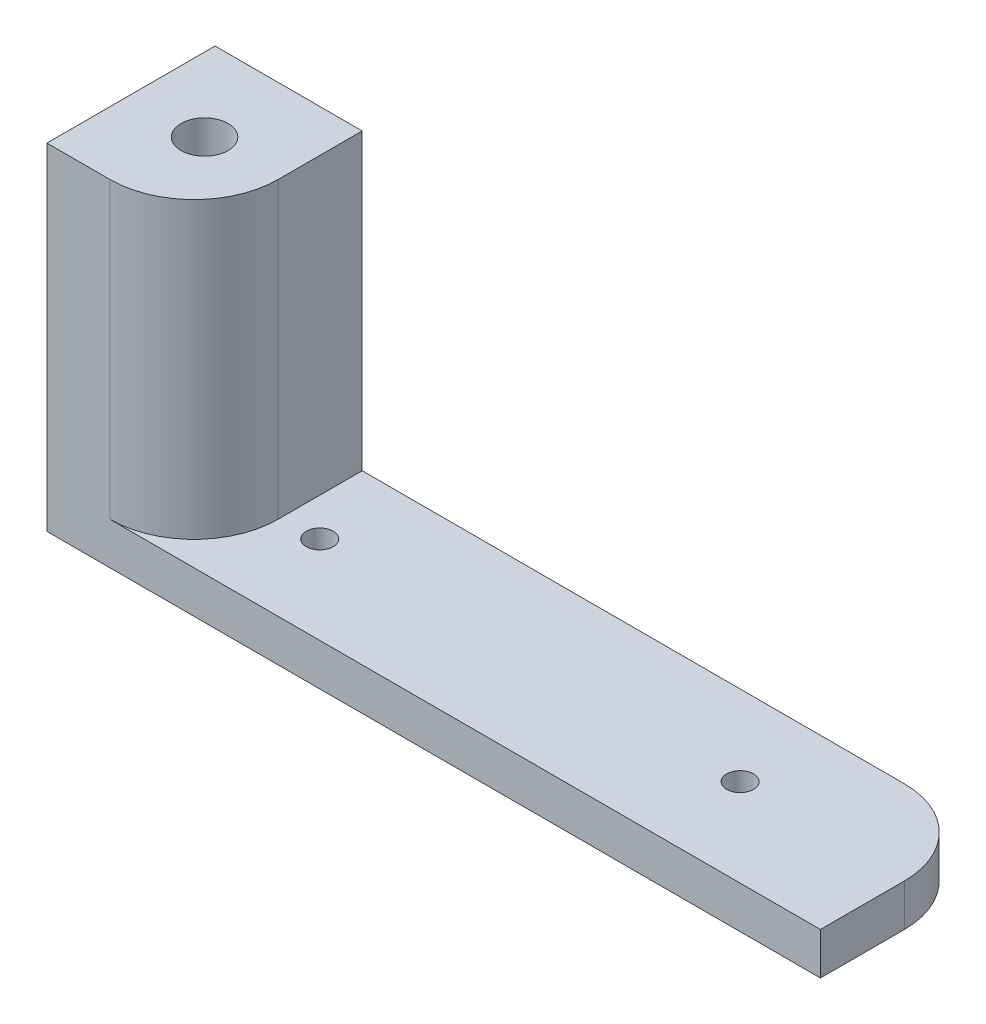
ISO-10303-21;
HEADER;
FILE_DESCRIPTION(('STEP AP214'),'2;1');
FILE_NAME('part.step','',(''),(''),'','','');
FILE_SCHEMA(('AUTOMOTIVE_DESIGN { 1 0 10303 214 1 1 1 1 }'));
ENDSEC;
DATA;
#1=APPLICATION_CONTEXT('core data for automotive mechanical design processes');
#2=APPLICATION_PROTOCOL_DEFINITION('international standard','automotive_design',2000,#1);
#3=PRODUCT_CONTEXT('',#1,'mechanical');
#4=PRODUCT('Part','Part','',(#3));
#5=PRODUCT_RELATED_PRODUCT_CATEGORY('part','',(#4));
#6=PRODUCT_DEFINITION_FORMATION('','',#4);
#7=PRODUCT_DEFINITION_CONTEXT('part definition',#1,'design');
#8=PRODUCT_DEFINITION('design','',#6,#7);
#9=PRODUCT_DEFINITION_SHAPE('','',#8);
#10=(LENGTH_UNIT() NAMED_UNIT(*) SI_UNIT(.MILLI.,.METRE.));
#11=(NAMED_UNIT(*) PLANE_ANGLE_UNIT() SI_UNIT($,.RADIAN.));
#12=(NAMED_UNIT(*) SI_UNIT($,.STERADIAN.) SOLID_ANGLE_UNIT());
#13=UNCERTAINTY_MEASURE_WITH_UNIT(LENGTH_MEASURE(1.E-05),#10,'distance_accuracy_value','');
#14=(GEOMETRIC_REPRESENTATION_CONTEXT(3) GLOBAL_UNCERTAINTY_ASSIGNED_CONTEXT((#13)) GLOBAL_UNIT_ASSIGNED_CONTEXT((#10,
#11,#12)) REPRESENTATION_CONTEXT('',''));
#15=CARTESIAN_POINT('',(0.,0.,0.));
#16=DIRECTION('',(0.,0.,1.));
#17=DIRECTION('',(1.,0.,0.));
#18=AXIS2_PLACEMENT_3D('',#15,#16,#17);
#19=CARTESIAN_POINT('',(0.,5.,0.));
#20=DIRECTION('',(0.,-1.,0.));
#21=DIRECTION('',(0.,0.,-1.));
#22=AXIS2_PLACEMENT_3D('',#19,#20,#21);
#23=PLANE('',#22);
#24=CARTESIAN_POINT('',(-24.,5.,-0.449999999999999));
#25=DIRECTION('',(0.,-1.,0.));
#26=DIRECTION('',(0.,0.,1.));
#27=AXIS2_PLACEMENT_3D('',#24,#25,#26);
#28=CIRCLE('',#27,1.6);
#29=CARTESIAN_POINT('',(-24.,5.,1.15));
#30=VERTEX_POINT('',#29);
#31=EDGE_CURVE('E243',#30,#30,#28,.T.);
#32=ORIENTED_EDGE('',*,*,#31,.T.);
#33=EDGE_LOOP('',(#32));
#34=FACE_BOUND('',#33,.T.);
#35=CARTESIAN_POINT('',(26.,5.,-0.449999999999999));
#36=DIRECTION('',(0.,-1.,0.));
#37=DIRECTION('',(0.,0.,1.));
#38=AXIS2_PLACEMENT_3D('',#35,#36,#37);
#39=CIRCLE('',#38,1.6);
#40=CARTESIAN_POINT('',(26.,5.,1.15));
#41=VERTEX_POINT('',#40);
#42=EDGE_CURVE('E239',#41,#41,#39,.T.);
#43=ORIENTED_EDGE('',*,*,#42,.T.);
#44=EDGE_LOOP('',(#43));
#45=FACE_BOUND('',#44,.T.);
#46=DIRECTION('',(0.,0.,1.));
#47=VECTOR('',#46,1.);
#48=CARTESIAN_POINT('',(-28.5,5.,-10.));
#49=LINE('',#48,#47);
#50=CARTESIAN_POINT('',(-28.5,5.,-10.));
#51=VERTEX_POINT('',#50);
#52=CARTESIAN_POINT('',(-28.5,5.,0.));
#53=VERTEX_POINT('',#52);
#54=EDGE_CURVE('E223',#51,#53,#49,.T.);
#55=ORIENTED_EDGE('',*,*,#54,.T.);
#56=CARTESIAN_POINT('',(-38.5,5.,0.));
#57=DIRECTION('',(0.,1.,0.));
#58=DIRECTION('',(0.,0.,-1.));
#59=AXIS2_PLACEMENT_3D('',#56,#57,#58);
#60=CIRCLE('',#59,10.);
#61=CARTESIAN_POINT('',(-38.5,5.,10.));
#62=VERTEX_POINT('',#61);
#63=EDGE_CURVE('E11',#62,#53,#60,.T.);
#64=ORIENTED_EDGE('',*,*,#63,.F.);
#65=DIRECTION('',(-1.,0.,0.));
#66=VECTOR('',#65,1.);
#67=CARTESIAN_POINT('',(46.,5.,10.));
#68=LINE('',#67,#66);
#69=CARTESIAN_POINT('',(46.,5.,10.));
#70=VERTEX_POINT('',#69);
#71=EDGE_CURVE('E155',#70,#62,#68,.T.);
#72=ORIENTED_EDGE('',*,*,#71,.F.);
#73=DIRECTION('',(0.,0.,1.));
#74=VECTOR('',#73,1.);
#75=CARTESIAN_POINT('',(46.,5.,10.));
#76=LINE('',#75,#74);
#77=CARTESIAN_POINT('',(46.,5.,0.));
#78=VERTEX_POINT('',#77);
#79=EDGE_CURVE('E165',#78,#70,#76,.T.);
#80=ORIENTED_EDGE('',*,*,#79,.F.);
#81=CARTESIAN_POINT('',(36.,5.,0.));
#82=DIRECTION('',(0.,1.,0.));
#83=DIRECTION('',(0.,0.,-1.));
#84=AXIS2_PLACEMENT_3D('',#81,#82,#83);
#85=CIRCLE('',#84,10.);
#86=CARTESIAN_POINT('',(36.,5.,-10.));
#87=VERTEX_POINT('',#86);
#88=EDGE_CURVE('E187',#87,#78,#85,.F.);
#89=ORIENTED_EDGE('',*,*,#88,.F.);
#90=DIRECTION('',(1.,0.,0.));
#91=VECTOR('',#90,1.);
#92=CARTESIAN_POINT('',(46.,5.,-10.));
#93=LINE('',#92,#91);
#94=EDGE_CURVE('E250',#51,#87,#93,.T.);
#95=ORIENTED_EDGE('',*,*,#94,.F.);
#96=EDGE_LOOP('',(#55,#64,#72,#80,#89,#95));
#97=FACE_BOUND('',#96,.T.);
#98=ADVANCED_FACE('F51',(#34,#45,#97),#23,.F.);
#99=CARTESIAN_POINT('',(-46.,5.,10.));
#100=DIRECTION('',(1.,0.,0.));
#101=DIRECTION('',(0.,0.,1.));
#102=AXIS2_PLACEMENT_3D('',#99,#100,#101);
#103=PLANE('',#102);
#104=DIRECTION('',(0.,0.,-1.));
#105=VECTOR('',#104,1.);
#106=CARTESIAN_POINT('',(-46.,0.,10.));
#107=LINE('',#106,#105);
#108=CARTESIAN_POINT('',(-46.,0.,10.));
#109=VERTEX_POINT('',#108);
#110=CARTESIAN_POINT('',(-46.,0.,0.));
#111=VERTEX_POINT('',#110);
#112=EDGE_CURVE('E152',#109,#111,#107,.T.);
#113=ORIENTED_EDGE('',*,*,#112,.F.);
#114=DIRECTION('',(0.,-1.,0.));
#115=VECTOR('',#114,1.);
#116=CARTESIAN_POINT('',(-46.,5.,10.));
#117=LINE('',#116,#115);
#118=CARTESIAN_POINT('',(-46.,40.,10.));
#119=VERTEX_POINT('',#118);
#120=EDGE_CURVE('E132',#119,#109,#117,.T.);
#121=ORIENTED_EDGE('',*,*,#120,.F.);
#122=DIRECTION('',(0.,0.,-1.));
#123=VECTOR('',#122,1.);
#124=CARTESIAN_POINT('',(-46.,40.,-10.));
#125=LINE('',#124,#123);
#126=CARTESIAN_POINT('',(-46.,40.,-10.));
#127=VERTEX_POINT('',#126);
#128=EDGE_CURVE('E137',#119,#127,#125,.T.);
#129=ORIENTED_EDGE('',*,*,#128,.T.);
#130=DIRECTION('',(0.,-1.,0.));
#131=VECTOR('',#130,1.);
#132=CARTESIAN_POINT('',(-46.,40.,-10.));
#133=LINE('',#132,#131);
#134=CARTESIAN_POINT('',(-46.,5.,-10.));
#135=VERTEX_POINT('',#134);
#136=EDGE_CURVE('E231',#127,#135,#133,.T.);
#137=ORIENTED_EDGE('',*,*,#136,.T.);
#138=DIRECTION('',(0.,0.,-1.));
#139=VECTOR('',#138,1.);
#140=CARTESIAN_POINT('',(-46.,5.,-10.));
#141=LINE('',#140,#139);
#142=CARTESIAN_POINT('',(-46.,5.,0.));
#143=VERTEX_POINT('',#142);
#144=EDGE_CURVE('E215',#143,#135,#141,.T.);
#145=ORIENTED_EDGE('',*,*,#144,.F.);
#146=DIRECTION('',(0.,-1.,0.));
#147=VECTOR('',#146,1.);
#148=CARTESIAN_POINT('',(-46.,5.,0.));
#149=LINE('',#148,#147);
#150=EDGE_CURVE('E183',#111,#143,#149,.F.);
#151=ORIENTED_EDGE('',*,*,#150,.F.);
#152=EDGE_LOOP('',(#113,#121,#129,#137,#145,#151));
#153=FACE_BOUND('',#152,.T.);
#154=ADVANCED_FACE('F149',(#153),#103,.F.);
#155=CARTESIAN_POINT('',(46.,5.,-10.));
#156=DIRECTION('',(0.,0.,1.));
#157=DIRECTION('',(-1.,0.,0.));
#158=AXIS2_PLACEMENT_3D('',#155,#156,#157);
#159=PLANE('',#158);
#160=ORIENTED_EDGE('',*,*,#94,.T.);
#161=DIRECTION('',(0.,-1.,0.));
#162=VECTOR('',#161,1.);
#163=CARTESIAN_POINT('',(36.,5.,-10.));
#164=LINE('',#163,#162);
#165=CARTESIAN_POINT('',(36.,0.,-10.));
#166=VERTEX_POINT('',#165);
#167=EDGE_CURVE('E162',#166,#87,#164,.F.);
#168=ORIENTED_EDGE('',*,*,#167,.F.);
#169=DIRECTION('',(1.,0.,0.));
#170=VECTOR('',#169,1.);
#171=CARTESIAN_POINT('',(46.,0.,-10.));
#172=LINE('',#171,#170);
#173=CARTESIAN_POINT('',(-36.,0.,-10.));
#174=VERTEX_POINT('',#173);
#175=EDGE_CURVE('E259',#174,#166,#172,.T.);
#176=ORIENTED_EDGE('',*,*,#175,.F.);
#177=DIRECTION('',(0.,-1.,0.));
#178=VECTOR('',#177,1.);
#179=CARTESIAN_POINT('',(-36.,5.,-10.));
#180=LINE('',#179,#178);
#181=CARTESIAN_POINT('',(-36.,5.,-10.));
#182=VERTEX_POINT('',#181);
#183=EDGE_CURVE('E173',#182,#174,#180,.T.);
#184=ORIENTED_EDGE('',*,*,#183,.F.);
#185=DIRECTION('',(1.,0.,0.));
#186=VECTOR('',#185,1.);
#187=CARTESIAN_POINT('',(-28.5,5.,-10.));
#188=LINE('',#187,#186);
#189=EDGE_CURVE('E209',#135,#182,#188,.T.);
#190=ORIENTED_EDGE('',*,*,#189,.F.);
#191=ORIENTED_EDGE('',*,*,#136,.F.);
#192=DIRECTION('',(1.,0.,0.));
#193=VECTOR('',#192,1.);
#194=CARTESIAN_POINT('',(-28.5,40.,-10.));
#195=LINE('',#194,#193);
#196=CARTESIAN_POINT('',(-28.5,40.,-10.));
#197=VERTEX_POINT('',#196);
#198=EDGE_CURVE('E143',#127,#197,#195,.T.);
#199=ORIENTED_EDGE('',*,*,#198,.T.);
#200=DIRECTION('',(0.,-1.,0.));
#201=VECTOR('',#200,1.);
#202=CARTESIAN_POINT('',(-28.5,40.,-10.));
#203=LINE('',#202,#201);
#204=EDGE_CURVE('E208',#197,#51,#203,.T.);
#205=ORIENTED_EDGE('',*,*,#204,.T.);
#206=EDGE_LOOP('',(#160,#168,#176,#184,#190,#191,#199,#205));
#207=FACE_BOUND('',#206,.T.);
#208=ADVANCED_FACE('F279',(#207),#159,.F.);
#209=CARTESIAN_POINT('',(46.,5.,10.));
#210=DIRECTION('',(-1.,0.,0.));
#211=DIRECTION('',(0.,0.,-1.));
#212=AXIS2_PLACEMENT_3D('',#209,#210,#211);
#213=PLANE('',#212);
#214=ORIENTED_EDGE('',*,*,#79,.T.);
#215=DIRECTION('',(0.,-1.,0.));
#216=VECTOR('',#215,1.);
#217=CARTESIAN_POINT('',(46.,5.,10.));
#218=LINE('',#217,#216);
#219=CARTESIAN_POINT('',(46.,0.,10.));
#220=VERTEX_POINT('',#219);
#221=EDGE_CURVE('E154',#70,#220,#218,.T.);
#222=ORIENTED_EDGE('',*,*,#221,.T.);
#223=DIRECTION('',(0.,0.,1.));
#224=VECTOR('',#223,1.);
#225=CARTESIAN_POINT('',(46.,0.,10.));
#226=LINE('',#225,#224);
#227=CARTESIAN_POINT('',(46.,0.,0.));
#228=VERTEX_POINT('',#227);
#229=EDGE_CURVE('E262',#228,#220,#226,.T.);
#230=ORIENTED_EDGE('',*,*,#229,.F.);
#231=DIRECTION('',(0.,-1.,0.));
#232=VECTOR('',#231,1.);
#233=CARTESIAN_POINT('',(46.,5.,0.));
#234=LINE('',#233,#232);
#235=EDGE_CURVE('E194',#78,#228,#234,.T.);
#236=ORIENTED_EDGE('',*,*,#235,.F.);
#237=EDGE_LOOP('',(#214,#222,#230,#236));
#238=FACE_BOUND('',#237,.T.);
#239=ADVANCED_FACE('F273',(#238),#213,.F.);
#240=CARTESIAN_POINT('',(46.,5.,10.));
#241=DIRECTION('',(0.,0.,-1.));
#242=DIRECTION('',(1.,0.,0.));
#243=AXIS2_PLACEMENT_3D('',#240,#241,#242);
#244=PLANE('',#243);
#245=DIRECTION('',(-1.,0.,0.));
#246=VECTOR('',#245,1.);
#247=CARTESIAN_POINT('',(-28.5,40.,10.));
#248=LINE('',#247,#246);
#249=CARTESIAN_POINT('',(-38.5,40.,10.));
#250=VERTEX_POINT('',#249);
#251=EDGE_CURVE('E128',#250,#119,#248,.T.);
#252=ORIENTED_EDGE('',*,*,#251,.T.);
#253=ORIENTED_EDGE('',*,*,#120,.T.);
#254=DIRECTION('',(-1.,0.,0.));
#255=VECTOR('',#254,1.);
#256=CARTESIAN_POINT('',(46.,0.,10.));
#257=LINE('',#256,#255);
#258=EDGE_CURVE('E168',#220,#109,#257,.T.);
#259=ORIENTED_EDGE('',*,*,#258,.F.);
#260=ORIENTED_EDGE('',*,*,#221,.F.);
#261=ORIENTED_EDGE('',*,*,#71,.T.);
#262=DIRECTION('',(0.,-1.,0.));
#263=VECTOR('',#262,1.);
#264=CARTESIAN_POINT('',(-38.5,5.,10.));
#265=LINE('',#264,#263);
#266=EDGE_CURVE('E135',#250,#62,#265,.T.);
#267=ORIENTED_EDGE('',*,*,#266,.F.);
#268=EDGE_LOOP('',(#252,#253,#259,#260,#261,#267));
#269=FACE_BOUND('',#268,.T.);
#270=ADVANCED_FACE('F130',(#269),#244,.F.);
#271=CARTESIAN_POINT('',(0.,0.,0.));
#272=DIRECTION('',(0.,-1.,0.));
#273=DIRECTION('',(0.,0.,-1.));
#274=AXIS2_PLACEMENT_3D('',#271,#272,#273);
#275=PLANE('',#274);
#276=CARTESIAN_POINT('',(-37.25,0.,0.));
#277=DIRECTION('',(0.,1.,0.));
#278=DIRECTION('',(0.,0.,-1.));
#279=AXIS2_PLACEMENT_3D('',#276,#277,#278);
#280=CIRCLE('',#279,2.8);
#281=CARTESIAN_POINT('',(-37.25,0.,2.8));
#282=VERTEX_POINT('',#281);
#283=EDGE_CURVE('E218',#282,#282,#280,.T.);
#284=ORIENTED_EDGE('',*,*,#283,.T.);
#285=EDGE_LOOP('',(#284));
#286=FACE_BOUND('',#285,.T.);
#287=CARTESIAN_POINT('',(26.,0.,-0.449999999999999));
#288=DIRECTION('',(0.,-1.,0.));
#289=DIRECTION('',(0.,0.,1.));
#290=AXIS2_PLACEMENT_3D('',#287,#288,#289);
#291=CIRCLE('',#290,1.6);
#292=CARTESIAN_POINT('',(26.,0.,1.15));
#293=VERTEX_POINT('',#292);
#294=EDGE_CURVE('E235',#293,#293,#291,.T.);
#295=ORIENTED_EDGE('',*,*,#294,.F.);
#296=EDGE_LOOP('',(#295));
#297=FACE_BOUND('',#296,.T.);
#298=CARTESIAN_POINT('',(-24.,0.,-0.449999999999999));
#299=DIRECTION('',(0.,-1.,0.));
#300=DIRECTION('',(0.,0.,1.));
#301=AXIS2_PLACEMENT_3D('',#298,#299,#300);
#302=CIRCLE('',#301,1.6);
#303=CARTESIAN_POINT('',(-24.,0.,1.15));
#304=VERTEX_POINT('',#303);
#305=EDGE_CURVE('E234',#304,#304,#302,.T.);
#306=ORIENTED_EDGE('',*,*,#305,.F.);
#307=EDGE_LOOP('',(#306));
#308=FACE_BOUND('',#307,.T.);
#309=ORIENTED_EDGE('',*,*,#175,.T.);
#310=CARTESIAN_POINT('',(36.,0.,0.));
#311=DIRECTION('',(0.,1.,0.));
#312=DIRECTION('',(0.,0.,-1.));
#313=AXIS2_PLACEMENT_3D('',#310,#311,#312);
#314=CIRCLE('',#313,10.);
#315=EDGE_CURVE('E177',#228,#166,#314,.T.);
#316=ORIENTED_EDGE('',*,*,#315,.F.);
#317=ORIENTED_EDGE('',*,*,#229,.T.);
#318=ORIENTED_EDGE('',*,*,#258,.T.);
#319=ORIENTED_EDGE('',*,*,#112,.T.);
#320=CARTESIAN_POINT('',(-36.,0.,0.));
#321=DIRECTION('',(0.,1.,0.));
#322=DIRECTION('',(0.,0.,-1.));
#323=AXIS2_PLACEMENT_3D('',#320,#321,#322);
#324=CIRCLE('',#323,10.);
#325=EDGE_CURVE('E180',#174,#111,#324,.T.);
#326=ORIENTED_EDGE('',*,*,#325,.F.);
#327=EDGE_LOOP('',(#309,#316,#317,#318,#319,#326));
#328=FACE_BOUND('',#327,.T.);
#329=ADVANCED_FACE('F269',(#286,#297,#308,#328),#275,.T.);
#330=CARTESIAN_POINT('',(-36.,5.,0.));
#331=DIRECTION('',(0.,-1.,0.));
#332=DIRECTION('',(0.,0.,-1.));
#333=AXIS2_PLACEMENT_3D('',#330,#331,#332);
#334=CYLINDRICAL_SURFACE('',#333,10.);
#335=CARTESIAN_POINT('',(-36.,5.,0.));
#336=DIRECTION('',(0.,1.,0.));
#337=DIRECTION('',(0.,0.,-1.));
#338=AXIS2_PLACEMENT_3D('',#335,#336,#337);
#339=CIRCLE('',#338,10.);
#340=EDGE_CURVE('E191',#143,#182,#339,.F.);
#341=ORIENTED_EDGE('',*,*,#340,.T.);
#342=ORIENTED_EDGE('',*,*,#183,.T.);
#343=ORIENTED_EDGE('',*,*,#325,.T.);
#344=ORIENTED_EDGE('',*,*,#150,.T.);
#345=EDGE_LOOP('',(#341,#342,#343,#344));
#346=FACE_BOUND('',#345,.T.);
#347=ADVANCED_FACE('F286',(#346),#334,.T.);
#348=CARTESIAN_POINT('',(36.,5.,0.));
#349=DIRECTION('',(0.,-1.,0.));
#350=DIRECTION('',(0.,0.,-1.));
#351=AXIS2_PLACEMENT_3D('',#348,#349,#350);
#352=CYLINDRICAL_SURFACE('',#351,10.);
#353=ORIENTED_EDGE('',*,*,#88,.T.);
#354=ORIENTED_EDGE('',*,*,#235,.T.);
#355=ORIENTED_EDGE('',*,*,#315,.T.);
#356=ORIENTED_EDGE('',*,*,#167,.T.);
#357=EDGE_LOOP('',(#353,#354,#355,#356));
#358=FACE_BOUND('',#357,.T.);
#359=ADVANCED_FACE('F288',(#358),#352,.T.);
#360=CARTESIAN_POINT('',(-24.,0.,-0.449999999999999));
#361=DIRECTION('',(0.,1.,0.));
#362=DIRECTION('',(0.,0.,1.));
#363=AXIS2_PLACEMENT_3D('',#360,#361,#362);
#364=CYLINDRICAL_SURFACE('',#363,1.6);
#365=ORIENTED_EDGE('',*,*,#305,.T.);
#366=EDGE_LOOP('',(#365));
#367=FACE_BOUND('',#366,.T.);
#368=ORIENTED_EDGE('',*,*,#31,.F.);
#369=EDGE_LOOP('',(#368));
#370=FACE_BOUND('',#369,.T.);
#371=ADVANCED_FACE('F290',(#367,#370),#364,.F.);
#372=CARTESIAN_POINT('',(26.,0.,-0.449999999999999));
#373=DIRECTION('',(0.,1.,0.));
#374=DIRECTION('',(0.,0.,1.));
#375=AXIS2_PLACEMENT_3D('',#372,#373,#374);
#376=CYLINDRICAL_SURFACE('',#375,1.6);
#377=ORIENTED_EDGE('',*,*,#294,.T.);
#378=EDGE_LOOP('',(#377));
#379=FACE_BOUND('',#378,.T.);
#380=ORIENTED_EDGE('',*,*,#42,.F.);
#381=EDGE_LOOP('',(#380));
#382=FACE_BOUND('',#381,.T.);
#383=ADVANCED_FACE('F294',(#379,#382),#376,.F.);
#384=CARTESIAN_POINT('',(0.,5.,0.));
#385=DIRECTION('',(0.,1.,0.));
#386=DIRECTION('',(0.,0.,1.));
#387=AXIS2_PLACEMENT_3D('',#384,#385,#386);
#388=PLANE('',#387);
#389=ORIENTED_EDGE('',*,*,#144,.T.);
#390=ORIENTED_EDGE('',*,*,#189,.T.);
#391=ORIENTED_EDGE('',*,*,#340,.F.);
#392=EDGE_LOOP('',(#389,#390,#391));
#393=FACE_BOUND('',#392,.T.);
#394=ADVANCED_FACE('F284',(#393),#388,.F.);
#395=CARTESIAN_POINT('',(-28.5,40.,-10.));
#396=DIRECTION('',(-1.,0.,0.));
#397=DIRECTION('',(0.,0.,-1.));
#398=AXIS2_PLACEMENT_3D('',#395,#396,#397);
#399=PLANE('',#398);
#400=ORIENTED_EDGE('',*,*,#54,.F.);
#401=ORIENTED_EDGE('',*,*,#204,.F.);
#402=DIRECTION('',(0.,0.,1.));
#403=VECTOR('',#402,1.);
#404=CARTESIAN_POINT('',(-28.5,40.,-10.));
#405=LINE('',#404,#403);
#406=CARTESIAN_POINT('',(-28.5,40.,0.));
#407=VERTEX_POINT('',#406);
#408=EDGE_CURVE('E138',#197,#407,#405,.T.);
#409=ORIENTED_EDGE('',*,*,#408,.T.);
#410=DIRECTION('',(0.,-1.,0.));
#411=VECTOR('',#410,1.);
#412=CARTESIAN_POINT('',(-28.5,40.,0.));
#413=LINE('',#412,#411);
#414=EDGE_CURVE('E73',#53,#407,#413,.F.);
#415=ORIENTED_EDGE('',*,*,#414,.F.);
#416=EDGE_LOOP('',(#400,#401,#409,#415));
#417=FACE_BOUND('',#416,.T.);
#418=ADVANCED_FACE('F207',(#417),#399,.F.);
#419=CARTESIAN_POINT('',(0.,40.,0.));
#420=DIRECTION('',(0.,1.,0.));
#421=DIRECTION('',(0.,0.,1.));
#422=AXIS2_PLACEMENT_3D('',#419,#420,#421);
#423=PLANE('',#422);
#424=CARTESIAN_POINT('',(-37.25,40.,0.));
#425=DIRECTION('',(0.,-1.,0.));
#426=DIRECTION('',(0.,0.,1.));
#427=AXIS2_PLACEMENT_3D('',#424,#425,#426);
#428=CIRCLE('',#427,2.8);
#429=CARTESIAN_POINT('',(-37.25,40.,2.8));
#430=VERTEX_POINT('',#429);
#431=EDGE_CURVE('E446',#430,#430,#428,.T.);
#432=ORIENTED_EDGE('',*,*,#431,.T.);
#433=EDGE_LOOP('',(#432));
#434=FACE_BOUND('',#433,.T.);
#435=ORIENTED_EDGE('',*,*,#408,.F.);
#436=ORIENTED_EDGE('',*,*,#198,.F.);
#437=ORIENTED_EDGE('',*,*,#128,.F.);
#438=ORIENTED_EDGE('',*,*,#251,.F.);
#439=CARTESIAN_POINT('',(-38.5,40.,0.));
#440=DIRECTION('',(0.,-1.,0.));
#441=DIRECTION('',(0.,0.,1.));
#442=AXIS2_PLACEMENT_3D('',#439,#440,#441);
#443=CIRCLE('',#442,10.);
#444=EDGE_CURVE('E60',#407,#250,#443,.T.);
#445=ORIENTED_EDGE('',*,*,#444,.F.);
#446=EDGE_LOOP('',(#435,#436,#437,#438,#445));
#447=FACE_BOUND('',#446,.T.);
#448=ADVANCED_FACE('F141',(#434,#447),#423,.T.);
#449=CARTESIAN_POINT('',(-37.25,-5.,0.));
#450=DIRECTION('',(0.,1.,0.));
#451=DIRECTION('',(0.,0.,1.));
#452=AXIS2_PLACEMENT_3D('',#449,#450,#451);
#453=CYLINDRICAL_SURFACE('',#452,2.8);
#454=CARTESIAN_POINT('',(-37.25,0.,2.8));
#455=CARTESIAN_POINT('',(-37.25,0.416666666666666,2.8));
#456=CARTESIAN_POINT('',(-37.25,0.833333333333332,2.8));
#457=CARTESIAN_POINT('',(-37.25,1.66666666666667,2.8));
#458=CARTESIAN_POINT('',(-37.25,2.08333333333333,2.8));
#459=CARTESIAN_POINT('',(-37.25,2.91666666666667,2.8));
#460=CARTESIAN_POINT('',(-37.25,3.33333333333333,2.8));
#461=CARTESIAN_POINT('',(-37.25,4.16666666666667,2.8));
#462=CARTESIAN_POINT('',(-37.25,4.58333333333333,2.8));
#463=CARTESIAN_POINT('',(-37.25,5.41666666666667,2.8));
#464=CARTESIAN_POINT('',(-37.25,5.83333333333333,2.8));
#465=CARTESIAN_POINT('',(-37.25,6.66666666666667,2.8));
#466=CARTESIAN_POINT('',(-37.25,7.08333333333333,2.8));
#467=CARTESIAN_POINT('',(-37.25,7.91666666666667,2.8));
#468=CARTESIAN_POINT('',(-37.25,8.33333333333333,2.8));
#469=CARTESIAN_POINT('',(-37.25,9.16666666666667,2.8));
#470=CARTESIAN_POINT('',(-37.25,9.58333333333333,2.8));
#471=CARTESIAN_POINT('',(-37.25,10.4166666666667,2.8));
#472=CARTESIAN_POINT('',(-37.25,10.8333333333333,2.8));
#473=CARTESIAN_POINT('',(-37.25,11.6666666666667,2.8));
#474=CARTESIAN_POINT('',(-37.25,12.0833333333333,2.8));
#475=CARTESIAN_POINT('',(-37.25,12.9166666666667,2.8));
#476=CARTESIAN_POINT('',(-37.25,13.3333333333333,2.8));
#477=CARTESIAN_POINT('',(-37.25,14.1666666666667,2.8));
#478=CARTESIAN_POINT('',(-37.25,14.5833333333333,2.8));
#479=CARTESIAN_POINT('',(-37.25,15.4166666666667,2.8));
#480=CARTESIAN_POINT('',(-37.25,15.8333333333333,2.8));
#481=CARTESIAN_POINT('',(-37.25,16.6666666666667,2.8));
#482=CARTESIAN_POINT('',(-37.25,17.0833333333333,2.8));
#483=CARTESIAN_POINT('',(-37.25,17.9166666666667,2.8));
#484=CARTESIAN_POINT('',(-37.25,18.3333333333333,2.8));
#485=CARTESIAN_POINT('',(-37.25,19.1666666666667,2.8));
#486=CARTESIAN_POINT('',(-37.25,19.5833333333333,2.8));
#487=CARTESIAN_POINT('',(-37.25,20.4166666666667,2.8));
#488=CARTESIAN_POINT('',(-37.25,20.8333333333333,2.8));
#489=CARTESIAN_POINT('',(-37.25,21.6666666666667,2.8));
#490=CARTESIAN_POINT('',(-37.25,22.0833333333333,2.8));
#491=CARTESIAN_POINT('',(-37.25,22.9166666666667,2.8));
#492=CARTESIAN_POINT('',(-37.25,23.3333333333333,2.8));
#493=CARTESIAN_POINT('',(-37.25,24.1666666666667,2.8));
#494=CARTESIAN_POINT('',(-37.25,24.5833333333333,2.8));
#495=CARTESIAN_POINT('',(-37.25,25.4166666666667,2.8));
#496=CARTESIAN_POINT('',(-37.25,25.8333333333333,2.8));
#497=CARTESIAN_POINT('',(-37.25,26.6666666666667,2.8));
#498=CARTESIAN_POINT('',(-37.25,27.0833333333333,2.8));
#499=CARTESIAN_POINT('',(-37.25,27.9166666666667,2.8));
#500=CARTESIAN_POINT('',(-37.25,28.3333333333333,2.8));
#501=CARTESIAN_POINT('',(-37.25,29.1666666666667,2.8));
#502=CARTESIAN_POINT('',(-37.25,29.5833333333333,2.8));
#503=CARTESIAN_POINT('',(-37.25,30.4166666666667,2.8));
#504=CARTESIAN_POINT('',(-37.25,30.8333333333333,2.8));
#505=CARTESIAN_POINT('',(-37.25,31.6666666666667,2.8));
#506=CARTESIAN_POINT('',(-37.25,32.0833333333333,2.8));
#507=CARTESIAN_POINT('',(-37.25,32.9166666666667,2.8));
#508=CARTESIAN_POINT('',(-37.25,33.3333333333333,2.8));
#509=CARTESIAN_POINT('',(-37.25,34.1666666666667,2.8));
#510=CARTESIAN_POINT('',(-37.25,34.5833333333333,2.8));
#511=CARTESIAN_POINT('',(-37.25,35.4166666666667,2.8));
#512=CARTESIAN_POINT('',(-37.25,35.8333333333333,2.8));
#513=CARTESIAN_POINT('',(-37.25,36.6666666666667,2.8));
#514=CARTESIAN_POINT('',(-37.25,37.0833333333333,2.8));
#515=CARTESIAN_POINT('',(-37.25,37.9166666666667,2.8));
#516=CARTESIAN_POINT('',(-37.25,38.3333333333333,2.8));
#517=CARTESIAN_POINT('',(-37.25,39.1666666666667,2.8));
#518=CARTESIAN_POINT('',(-37.25,39.5833333333333,2.8));
#519=CARTESIAN_POINT('',(-37.25,40.,2.8));
#520=B_SPLINE_CURVE_WITH_KNOTS('',3,(#454,#455,#456,#457,#458,#459,#460,#461,#462,#463,#464,
#465,#466,#467,#468,#469,#470,#471,#472,#473,#474,#475,#476,#477,#478,#479,#480,#481,#482,#483,
#484,#485,#486,#487,#488,#489,#490,#491,#492,#493,#494,#495,#496,#497,#498,#499,#500,#501,#502,
#503,#504,#505,#506,#507,#508,#509,#510,#511,#512,#513,#514,#515,#516,#517,#518,#519),
.UNSPECIFIED.,.F.,.F.,(4,2,2,2,2,2,2,2,2,2,2,2,2,2,2,2,2,2,2,2,2,2,2,2,2,2,2,2,2,2,2,2,4),(0.,
1.25,2.5,3.75,5.,6.25,7.5,8.75,10.,11.25,12.5,13.75,15.,16.25,17.5,18.75,20.,21.25,22.5,23.75,
25.,26.25,27.5,28.75,30.,31.25,32.5,33.75,35.,36.25,37.5,38.75,40.),.UNSPECIFIED.);
#521=EDGE_CURVE('BSEAM374',#282,#430,#520,.T.);
#522=ORIENTED_EDGE('',*,*,#283,.F.);
#523=ORIENTED_EDGE('',*,*,#431,.F.);
#524=ORIENTED_EDGE('',*,*,#521,.T.);
#525=ORIENTED_EDGE('',*,*,#521,.F.);
#526=EDGE_LOOP('',(#522,#524,#523,#525));
#527=FACE_BOUND('',#526,.T.);
#528=ADVANCED_FACE('F374',(#527),#453,.F.);
#529=CARTESIAN_POINT('',(-38.5,5.,0.));
#530=DIRECTION('',(0.,-1.,0.));
#531=DIRECTION('',(0.,0.,-1.));
#532=AXIS2_PLACEMENT_3D('',#529,#530,#531);
#533=CYLINDRICAL_SURFACE('',#532,10.);
#534=ORIENTED_EDGE('',*,*,#444,.T.);
#535=ORIENTED_EDGE('',*,*,#266,.T.);
#536=ORIENTED_EDGE('',*,*,#63,.T.);
#537=ORIENTED_EDGE('',*,*,#414,.T.);
#538=EDGE_LOOP('',(#534,#535,#536,#537));
#539=FACE_BOUND('',#538,.T.);
#540=ADVANCED_FACE('F53',(#539),#533,.T.);
#541=CLOSED_SHELL('',(#98,#154,#208,#239,#270,#329,#347,#359,#371,#383,#394,#418,#448,#528,#540));
#542=MANIFOLD_SOLID_BREP('B2',#541);
#543=ADVANCED_BREP_SHAPE_REPRESENTATION('',(#18,#542),#14);
#544=SHAPE_DEFINITION_REPRESENTATION(#9,#543);
ENDSEC;
END-ISO-10303-21;
